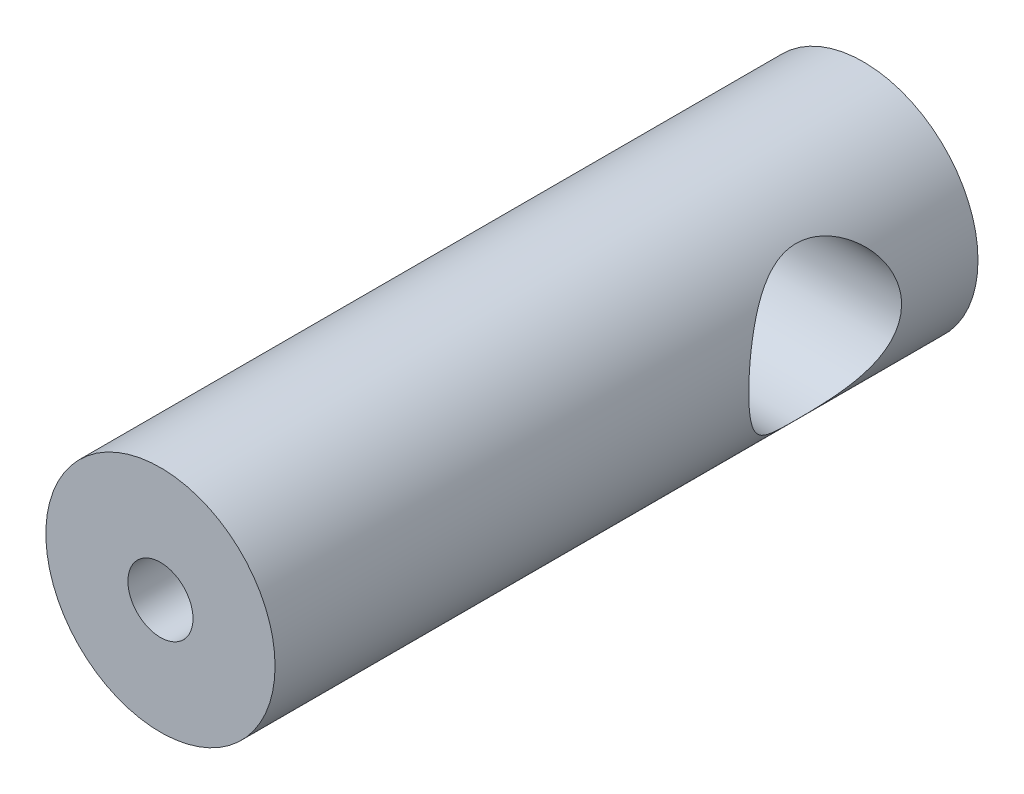
ISO-10303-21;
HEADER;
FILE_DESCRIPTION(('STEP AP214'),'2;1');
FILE_NAME('part.step','',(''),(''),'','','');
FILE_SCHEMA(('AUTOMOTIVE_DESIGN { 1 0 10303 214 1 1 1 1 }'));
ENDSEC;
DATA;
#1=APPLICATION_CONTEXT('core data for automotive mechanical design processes');
#2=APPLICATION_PROTOCOL_DEFINITION('international standard','automotive_design',2000,#1);
#3=PRODUCT_CONTEXT('',#1,'mechanical');
#4=PRODUCT('Part','Part','',(#3));
#5=PRODUCT_RELATED_PRODUCT_CATEGORY('part','',(#4));
#6=PRODUCT_DEFINITION_FORMATION('','',#4);
#7=PRODUCT_DEFINITION_CONTEXT('part definition',#1,'design');
#8=PRODUCT_DEFINITION('design','',#6,#7);
#9=PRODUCT_DEFINITION_SHAPE('','',#8);
#10=(LENGTH_UNIT() NAMED_UNIT(*) SI_UNIT(.MILLI.,.METRE.));
#11=(NAMED_UNIT(*) PLANE_ANGLE_UNIT() SI_UNIT($,.RADIAN.));
#12=(NAMED_UNIT(*) SI_UNIT($,.STERADIAN.) SOLID_ANGLE_UNIT());
#13=UNCERTAINTY_MEASURE_WITH_UNIT(LENGTH_MEASURE(1.E-05),#10,'distance_accuracy_value','');
#14=(GEOMETRIC_REPRESENTATION_CONTEXT(3) GLOBAL_UNCERTAINTY_ASSIGNED_CONTEXT((#13)) GLOBAL_UNIT_ASSIGNED_CONTEXT((#10,
#11,#12)) REPRESENTATION_CONTEXT('',''));
#15=CARTESIAN_POINT('',(0.,0.,0.));
#16=DIRECTION('',(0.,0.,1.));
#17=DIRECTION('',(1.,0.,0.));
#18=AXIS2_PLACEMENT_3D('',#15,#16,#17);
#19=CARTESIAN_POINT('',(0.,0.,29.21));
#20=DIRECTION('',(0.,0.,-1.));
#21=DIRECTION('',(-1.,0.,0.));
#22=AXIS2_PLACEMENT_3D('',#19,#20,#21);
#23=CYLINDRICAL_SURFACE('',#22,4.7625);
#24=CARTESIAN_POINT('',(-4.7625,0.,3.175));
#25=CARTESIAN_POINT('',(-4.76249829558772,0.159513506146526,3.17500214612326));
#26=CARTESIAN_POINT('',(-4.75441585981929,0.319036822940597,3.18708798621756));
#27=CARTESIAN_POINT('',(-4.72288699141972,0.632990333269339,3.2346842124704));
#28=CARTESIAN_POINT('',(-4.6994332647002,0.787418072256469,3.27020571953271));
#29=CARTESIAN_POINT('',(-4.63947623936465,1.08618661185831,3.36249621667313));
#30=CARTESIAN_POINT('',(-4.60303407934685,1.23057094564588,3.41916571764626));
#31=CARTESIAN_POINT('',(-4.52002748417047,1.50719688917279,3.55133803130145));
#32=CARTESIAN_POINT('',(-4.47346157948094,1.63943673208792,3.62684357839962));
#33=CARTESIAN_POINT('',(-4.36923384005694,1.90068942785739,3.80151790553973));
#34=CARTESIAN_POINT('',(-4.31096574538352,2.0284762255929,3.90215098363579));
#35=CARTESIAN_POINT('',(-4.19071922389352,2.26651828028912,4.12072144753205));
#36=CARTESIAN_POINT('',(-4.12873555797057,2.37674794067855,4.23868362477028));
#37=CARTESIAN_POINT('',(-3.99618620055343,2.59432897361932,4.51017063514477));
#38=CARTESIAN_POINT('',(-3.92580920318787,2.69848308269039,4.66636997487355));
#39=CARTESIAN_POINT('',(-3.79546083955007,2.87893691841686,4.99802686160152));
#40=CARTESIAN_POINT('',(-3.73547157335729,2.95528481583058,5.17345041238712));
#41=CARTESIAN_POINT('',(-3.65087323287846,3.0587003056751,5.48752917837351));
#42=CARTESIAN_POINT('',(-3.62104984276855,3.09363184983488,5.62217641895692));
#43=CARTESIAN_POINT('',(-3.57597026836952,3.14564105737718,5.89715690125781));
#44=CARTESIAN_POINT('',(-3.56068897885195,3.16274949511548,6.03747990609092));
#45=CARTESIAN_POINT('',(-3.54705611398895,3.17803790572636,6.32059121144639));
#46=CARTESIAN_POINT('',(-3.54877374048434,3.17614050629003,6.46338722475806));
#47=CARTESIAN_POINT('',(-3.56901393593137,3.1533716036927,6.74629552040347));
#48=CARTESIAN_POINT('',(-3.58755074204361,3.13248402562585,6.88640542637181));
#49=CARTESIAN_POINT('',(-3.63739407712628,3.07443178311274,7.1540164439586));
#50=CARTESIAN_POINT('',(-3.66810112544892,3.03802591942409,7.28180112117996));
#51=CARTESIAN_POINT('',(-3.73871526235139,2.95068813219861,7.52955010979677));
#52=CARTESIAN_POINT('',(-3.77862537744388,2.89975142875274,7.64951183185715));
#53=CARTESIAN_POINT('',(-3.87293161809884,2.77294687249444,7.90420281498847));
#54=CARTESIAN_POINT('',(-3.92862304429405,2.69411533030023,8.03697259197917));
#55=CARTESIAN_POINT('',(-4.04322816135652,2.51886974692605,8.28894614005392));
#56=CARTESIAN_POINT('',(-4.10214576296336,2.42243402035991,8.40813288170832));
#57=CARTESIAN_POINT('',(-4.23137558230652,2.19045099950254,8.65591129113202));
#58=CARTESIAN_POINT('',(-4.30140657245416,2.05095377025593,8.78099280228032));
#59=CARTESIAN_POINT('',(-4.43258734804499,1.74943769853673,9.00619943508341));
#60=CARTESIAN_POINT('',(-4.493745420159,1.58744015020742,9.10634790583761));
#61=CARTESIAN_POINT('',(-4.59018328993748,1.2777118005163,9.26064587831312));
#62=CARTESIAN_POINT('',(-4.62818577100373,1.13340775885305,9.31996383930038));
#63=CARTESIAN_POINT('',(-4.69118503960837,0.835082219747423,9.41721656943046));
#64=CARTESIAN_POINT('',(-4.71619281752454,0.681069057915079,9.45516941057244));
#65=CARTESIAN_POINT('',(-4.75100462923954,0.366689406911029,9.50779334981527));
#66=CARTESIAN_POINT('',(-4.76074299407139,0.20629850144547,9.52236389423949));
#67=CARTESIAN_POINT('',(-4.76381945007165,-0.115000912030588,9.52697975309251));
#68=CARTESIAN_POINT('',(-4.75715868774695,-0.275909383071223,9.51702678202589));
#69=CARTESIAN_POINT('',(-4.72915598211033,-0.581748451061776,9.47479681179543));
#70=CARTESIAN_POINT('',(-4.70887816144478,-0.72700744342839,9.44413703981371));
#71=CARTESIAN_POINT('',(-4.65643038239684,-1.00983477297833,9.36371684845446));
#72=CARTESIAN_POINT('',(-4.62425852748368,-1.14740187964355,9.313953382901));
#73=CARTESIAN_POINT('',(-4.54812959640013,-1.42028029136544,9.19376447844169));
#74=CARTESIAN_POINT('',(-4.50357668840463,-1.55495019310495,9.12227005539697));
#75=CARTESIAN_POINT('',(-4.40692945783369,-1.81083430052963,8.96233715220837));
#76=CARTESIAN_POINT('',(-4.35483048266614,-1.93204012275933,8.87388820764801));
#77=CARTESIAN_POINT('',(-4.23790342811905,-2.17781894704303,8.66678500930826));
#78=CARTESIAN_POINT('',(-4.17236523918599,-2.29989360271145,8.54556606216409));
#79=CARTESIAN_POINT('',(-4.04131737275621,-2.52307674305787,8.28498560490976));
#80=CARTESIAN_POINT('',(-3.97580774594569,-2.62417073664107,8.14561166279185));
#81=CARTESIAN_POINT('',(-3.85666740360083,-2.79598082787364,7.86266141984501));
#82=CARTESIAN_POINT('',(-3.80250060257811,-2.86854322403869,7.72043789728911));
#83=CARTESIAN_POINT('',(-3.70584371667973,-2.99237739257787,7.42335216383611));
#84=CARTESIAN_POINT('',(-3.66333266217137,-3.04368748566418,7.2685133089184));
#85=CARTESIAN_POINT('',(-3.60256467927561,-3.11524401668582,6.97775387782636));
#86=CARTESIAN_POINT('',(-3.58132059145467,-3.13941774208684,6.84343975609328));
#87=CARTESIAN_POINT('',(-3.55408653184003,-3.17022488831674,6.57133991164026));
#88=CARTESIAN_POINT('',(-3.54807999179148,-3.17687736084457,6.43355812425448));
#89=CARTESIAN_POINT('',(-3.55225668535638,-3.17220478264998,6.15847916327206));
#90=CARTESIAN_POINT('',(-3.56244950530632,-3.16086908702961,6.02118232484977));
#91=CARTESIAN_POINT('',(-3.59744096141944,-3.12097725174618,5.75096708934584));
#92=CARTESIAN_POINT('',(-3.6222590824651,-3.09239813794198,5.61805478357153));
#93=CARTESIAN_POINT('',(-3.69136350740653,-3.00978981561158,5.32493377101032));
#94=CARTESIAN_POINT('',(-3.7390752101256,-2.9510082914772,5.16688867807124));
#95=CARTESIAN_POINT('',(-3.84527739400297,-2.81121528101009,4.86491347639415));
#96=CARTESIAN_POINT('',(-3.90378297026142,-2.7301725841297,4.7210035728833));
#97=CARTESIAN_POINT('',(-4.02617059026332,-2.54632873237353,4.44614450366364));
#98=CARTESIAN_POINT('',(-4.09013111420677,-2.44315837250285,4.31547893626395));
#99=CARTESIAN_POINT('',(-4.21685775015533,-2.21726660759133,4.07140861594258));
#100=CARTESIAN_POINT('',(-4.27962348959933,-2.09453921249741,3.95800917227569));
#101=CARTESIAN_POINT('',(-4.37333498138708,-1.88738506601081,3.79508141501688));
#102=CARTESIAN_POINT('',(-4.40641312548886,-1.8090134436431,3.73897238013268));
#103=CARTESIAN_POINT('',(-4.46961905722943,-1.64665981934885,3.63366220114295));
#104=CARTESIAN_POINT('',(-4.49974819878214,-1.56268042207704,3.58445788247664));
#105=CARTESIAN_POINT('',(-4.55616827072524,-1.38960715113393,3.49357643775622));
#106=CARTESIAN_POINT('',(-4.58246276002165,-1.30051812806183,3.45189232363784));
#107=CARTESIAN_POINT('',(-4.63042056995049,-1.11782960098096,3.37664327179394));
#108=CARTESIAN_POINT('',(-4.65208551661339,-1.02423169482463,3.34307548283161));
#109=CARTESIAN_POINT('',(-4.70058109652366,-0.780235392827377,3.26845860015882));
#110=CARTESIAN_POINT('',(-4.72362103868264,-0.627104096318097,3.23357234310822));
#111=CARTESIAN_POINT('',(-4.75457565287333,-0.315982580686495,3.18685063903055));
#112=CARTESIAN_POINT('',(-4.76250168819873,-0.15799610278521,3.17499787429216));
#113=CARTESIAN_POINT('',(-4.7625,0.,3.175));
#114=B_SPLINE_CURVE_WITH_KNOTS('',3,(#24,#25,#26,#27,#28,#29,#30,#31,#32,#33,#34,#35,#36,#37,
#38,#39,#40,#41,#42,#43,#44,#45,#46,#47,#48,#49,#50,#51,#52,#53,#54,#55,#56,#57,#58,#59,#60,#61,
#62,#63,#64,#65,#66,#67,#68,#69,#70,#71,#72,#73,#74,#75,#76,#77,#78,#79,#80,#81,#82,#83,#84,#85,
#86,#87,#88,#89,#90,#91,#92,#93,#94,#95,#96,#97,#98,#99,#100,#101,#102,#103,#104,#105,#106,#107,
#108,#109,#110,#111,#112,#113),.UNSPECIFIED.,.T.,.F.,(4,2,2,2,2,2,2,2,2,2,2,2,2,2,2,2,2,2,2,2,2,
2,2,2,2,2,2,2,2,2,2,2,2,2,2,2,2,2,2,2,2,2,2,2,4),(0.,0.477921997077322,0.956070945278542,
1.43199826818949,1.90799472139476,2.42438283538384,2.94151703421856,3.54023109732372,
4.13790297394634,4.56300988710696,4.98738156455222,5.41348154879913,5.83994255655572,
6.24758818745149,6.6553680680092,7.14609274784495,7.63742604761198,8.23466340273952,
8.83133933988771,9.31106989228961,9.79039404549574,10.2717740223998,10.7531203456965,
11.2006552211841,11.6482614879236,12.1229810060221,12.5979944723587,13.1481222963466,
13.6986288317687,14.2025677230621,14.7055939480251,15.1181442623597,15.5302458053914,
15.9425913096208,16.3554874162604,16.8784049132826,17.4020593249786,17.9352455177248,
18.4685953331297,18.7739424593009,19.0791487337135,19.3840699212457,19.6888838348845,
20.1626158186784,20.635991489477),.UNSPECIFIED.);
#115=CARTESIAN_POINT('',(-4.7625,0.,3.175));
#116=VERTEX_POINT('',#115);
#117=EDGE_CURVE('E11',#116,#116,#114,.T.);
#118=ORIENTED_EDGE('',*,*,#117,.T.);
#119=EDGE_LOOP('',(#118));
#120=FACE_BOUND('',#119,.T.);
#121=CARTESIAN_POINT('',(4.7625,0.,3.175));
#122=CARTESIAN_POINT('',(4.76249829558771,-0.159513506146526,3.17500214612326));
#123=CARTESIAN_POINT('',(4.75441585981929,-0.319036822940598,3.18708798621756));
#124=CARTESIAN_POINT('',(4.72288699141973,-0.632990333269339,3.2346842124704));
#125=CARTESIAN_POINT('',(4.6994332647002,-0.787418072256469,3.27020571953271));
#126=CARTESIAN_POINT('',(4.63947623936465,-1.08618661185831,3.36249621667313));
#127=CARTESIAN_POINT('',(4.60303407934685,-1.23057094564588,3.41916571764626));
#128=CARTESIAN_POINT('',(4.52002748417047,-1.50719688917279,3.55133803130145));
#129=CARTESIAN_POINT('',(4.47346157948094,-1.63943673208792,3.62684357839962));
#130=CARTESIAN_POINT('',(4.36923384005694,-1.9006894278574,3.80151790553973));
#131=CARTESIAN_POINT('',(4.31096574538352,-2.0284762255929,3.90215098363579));
#132=CARTESIAN_POINT('',(4.19071922389352,-2.26651828028912,4.12072144753205));
#133=CARTESIAN_POINT('',(4.12873555797056,-2.37674794067855,4.23868362477028));
#134=CARTESIAN_POINT('',(3.99618620055343,-2.59432897361933,4.51017063514477));
#135=CARTESIAN_POINT('',(3.92580920318787,-2.69848308269039,4.66636997487356));
#136=CARTESIAN_POINT('',(3.79546083955007,-2.87893691841686,4.99802686160152));
#137=CARTESIAN_POINT('',(3.73547157335728,-2.95528481583058,5.17345041238712));
#138=CARTESIAN_POINT('',(3.65087323287846,-3.0587003056751,5.48752917837351));
#139=CARTESIAN_POINT('',(3.62104984276855,-3.09363184983488,5.62217641895692));
#140=CARTESIAN_POINT('',(3.57597026836952,-3.14564105737718,5.89715690125782));
#141=CARTESIAN_POINT('',(3.56068897885195,-3.16274949511548,6.03747990609092));
#142=CARTESIAN_POINT('',(3.54705611398895,-3.17803790572636,6.32059121144639));
#143=CARTESIAN_POINT('',(3.54877374048434,-3.17614050629003,6.46338722475806));
#144=CARTESIAN_POINT('',(3.56901393593137,-3.1533716036927,6.74629552040347));
#145=CARTESIAN_POINT('',(3.58755074204361,-3.13248402562585,6.88640542637181));
#146=CARTESIAN_POINT('',(3.63739407712628,-3.07443178311274,7.1540164439586));
#147=CARTESIAN_POINT('',(3.66810112544892,-3.03802591942409,7.28180112117996));
#148=CARTESIAN_POINT('',(3.73871526235139,-2.95068813219861,7.52955010979677));
#149=CARTESIAN_POINT('',(3.77862537744388,-2.89975142875274,7.64951183185715));
#150=CARTESIAN_POINT('',(3.87293161809884,-2.77294687249444,7.90420281498847));
#151=CARTESIAN_POINT('',(3.92862304429405,-2.69411533030023,8.03697259197917));
#152=CARTESIAN_POINT('',(4.04322816135652,-2.51886974692605,8.28894614005392));
#153=CARTESIAN_POINT('',(4.10214576296336,-2.42243402035992,8.40813288170832));
#154=CARTESIAN_POINT('',(4.23137558230652,-2.19045099950254,8.65591129113202));
#155=CARTESIAN_POINT('',(4.30140657245416,-2.05095377025594,8.78099280228032));
#156=CARTESIAN_POINT('',(4.43258734804498,-1.74943769853673,9.00619943508341));
#157=CARTESIAN_POINT('',(4.493745420159,-1.58744015020742,9.10634790583761));
#158=CARTESIAN_POINT('',(4.59018328993748,-1.2777118005163,9.26064587831312));
#159=CARTESIAN_POINT('',(4.62818577100373,-1.13340775885305,9.31996383930038));
#160=CARTESIAN_POINT('',(4.69118503960838,-0.835082219747425,9.41721656943046));
#161=CARTESIAN_POINT('',(4.71619281752454,-0.681069057915081,9.45516941057244));
#162=CARTESIAN_POINT('',(4.75100462923954,-0.366689406911031,9.50779334981527));
#163=CARTESIAN_POINT('',(4.76074299407139,-0.206298501445472,9.52236389423949));
#164=CARTESIAN_POINT('',(4.76381945007165,0.115000912030586,9.52697975309251));
#165=CARTESIAN_POINT('',(4.75715868774695,0.275909383071221,9.51702678202589));
#166=CARTESIAN_POINT('',(4.72915598211033,0.581748451061775,9.47479681179543));
#167=CARTESIAN_POINT('',(4.70887816144478,0.727007443428389,9.44413703981371));
#168=CARTESIAN_POINT('',(4.65643038239684,1.00983477297833,9.36371684845446));
#169=CARTESIAN_POINT('',(4.62425852748368,1.14740187964354,9.313953382901));
#170=CARTESIAN_POINT('',(4.54812959640013,1.42028029136544,9.19376447844169));
#171=CARTESIAN_POINT('',(4.50357668840463,1.55495019310495,9.12227005539697));
#172=CARTESIAN_POINT('',(4.40692945783369,1.81083430052963,8.96233715220837));
#173=CARTESIAN_POINT('',(4.35483048266614,1.93204012275933,8.87388820764801));
#174=CARTESIAN_POINT('',(4.23790342811905,2.17781894704303,8.66678500930826));
#175=CARTESIAN_POINT('',(4.17236523918599,2.29989360271145,8.54556606216409));
#176=CARTESIAN_POINT('',(4.04131737275621,2.52307674305787,8.28498560490976));
#177=CARTESIAN_POINT('',(3.97580774594569,2.62417073664107,8.14561166279185));
#178=CARTESIAN_POINT('',(3.85666740360083,2.79598082787364,7.86266141984501));
#179=CARTESIAN_POINT('',(3.8025006025781,2.86854322403869,7.72043789728911));
#180=CARTESIAN_POINT('',(3.70584371667973,2.99237739257787,7.42335216383611));
#181=CARTESIAN_POINT('',(3.66333266217137,3.04368748566418,7.2685133089184));
#182=CARTESIAN_POINT('',(3.60256467927561,3.11524401668582,6.97775387782636));
#183=CARTESIAN_POINT('',(3.58132059145467,3.13941774208684,6.84343975609328));
#184=CARTESIAN_POINT('',(3.55408653184003,3.17022488831674,6.57133991164026));
#185=CARTESIAN_POINT('',(3.54807999179148,3.17687736084457,6.43355812425448));
#186=CARTESIAN_POINT('',(3.55225668535638,3.17220478264998,6.15847916327206));
#187=CARTESIAN_POINT('',(3.56244950530632,3.16086908702961,6.02118232484977));
#188=CARTESIAN_POINT('',(3.59744096141944,3.12097725174618,5.75096708934584));
#189=CARTESIAN_POINT('',(3.6222590824651,3.09239813794198,5.61805478357153));
#190=CARTESIAN_POINT('',(3.69136350740653,3.00978981561158,5.32493377101032));
#191=CARTESIAN_POINT('',(3.7390752101256,2.9510082914772,5.16688867807125));
#192=CARTESIAN_POINT('',(3.84527739400296,2.8112152810101,4.86491347639415));
#193=CARTESIAN_POINT('',(3.90378297026142,2.7301725841297,4.72100357288331));
#194=CARTESIAN_POINT('',(4.02617059026332,2.54632873237354,4.44614450366364));
#195=CARTESIAN_POINT('',(4.09013111420677,2.44315837250285,4.31547893626395));
#196=CARTESIAN_POINT('',(4.21685775015533,2.21726660759133,4.07140861594258));
#197=CARTESIAN_POINT('',(4.27962348959933,2.09453921249741,3.9580091722757));
#198=CARTESIAN_POINT('',(4.37333498138708,1.88738506601081,3.79508141501688));
#199=CARTESIAN_POINT('',(4.40641312548886,1.8090134436431,3.73897238013268));
#200=CARTESIAN_POINT('',(4.46961905722943,1.64665981934885,3.63366220114295));
#201=CARTESIAN_POINT('',(4.49974819878214,1.56268042207704,3.58445788247664));
#202=CARTESIAN_POINT('',(4.55616827072524,1.38960715113393,3.49357643775622));
#203=CARTESIAN_POINT('',(4.58246276002165,1.30051812806183,3.45189232363784));
#204=CARTESIAN_POINT('',(4.63042056995049,1.11782960098096,3.37664327179394));
#205=CARTESIAN_POINT('',(4.65208551661339,1.02423169482463,3.34307548283161));
#206=CARTESIAN_POINT('',(4.70058109652366,0.780235392827378,3.26845860015882));
#207=CARTESIAN_POINT('',(4.72362103868264,0.627104096318098,3.23357234310822));
#208=CARTESIAN_POINT('',(4.75457565287333,0.315982580686496,3.18685063903055));
#209=CARTESIAN_POINT('',(4.76250168819872,0.15799610278521,3.17499787429216));
#210=CARTESIAN_POINT('',(4.7625,0.,3.175));
#211=B_SPLINE_CURVE_WITH_KNOTS('',3,(#121,#122,#123,#124,#125,#126,#127,#128,#129,#130,#131,
#132,#133,#134,#135,#136,#137,#138,#139,#140,#141,#142,#143,#144,#145,#146,#147,#148,#149,#150,
#151,#152,#153,#154,#155,#156,#157,#158,#159,#160,#161,#162,#163,#164,#165,#166,#167,#168,#169,
#170,#171,#172,#173,#174,#175,#176,#177,#178,#179,#180,#181,#182,#183,#184,#185,#186,#187,#188,
#189,#190,#191,#192,#193,#194,#195,#196,#197,#198,#199,#200,#201,#202,#203,#204,#205,#206,#207,
#208,#209,#210),.UNSPECIFIED.,.T.,.F.,(4,2,2,2,2,2,2,2,2,2,2,2,2,2,2,2,2,2,2,2,2,2,2,2,2,2,2,2,
2,2,2,2,2,2,2,2,2,2,2,2,2,2,2,2,4),(0.,0.477921997077322,0.956070945278543,1.43199826818949,
1.90799472139476,2.42438283538384,2.94151703421856,3.54023109732372,4.13790297394634,
4.56300988710696,4.98738156455222,5.41348154879913,5.83994255655572,6.24758818745149,
6.6553680680092,7.14609274784495,7.63742604761198,8.23466340273952,8.83133933988771,
9.31106989228962,9.79039404549574,10.2717740223998,10.7531203456965,11.2006552211841,
11.6482614879236,12.1229810060221,12.5979944723587,13.1481222963466,13.6986288317687,
14.2025677230621,14.7055939480251,15.1181442623597,15.5302458053914,15.9425913096208,
16.3554874162604,16.8784049132826,17.4020593249786,17.9352455177248,18.4685953331297,
18.7739424593009,19.0791487337135,19.3840699212457,19.6888838348845,20.1626158186784,
20.635991489477),.UNSPECIFIED.);
#212=CARTESIAN_POINT('',(4.7625,0.,3.175));
#213=VERTEX_POINT('',#212);
#214=EDGE_CURVE('E61',#213,#213,#211,.T.);
#215=ORIENTED_EDGE('',*,*,#214,.T.);
#216=EDGE_LOOP('',(#215));
#217=FACE_BOUND('',#216,.T.);
#218=CARTESIAN_POINT('',(0.,0.,29.21));
#219=DIRECTION('',(0.,0.,1.));
#220=DIRECTION('',(1.,0.,0.));
#221=AXIS2_PLACEMENT_3D('',#218,#219,#220);
#222=CIRCLE('',#221,4.7625);
#223=CARTESIAN_POINT('',(4.7625,0.,29.21));
#224=VERTEX_POINT('',#223);
#225=EDGE_CURVE('E81',#224,#224,#222,.T.);
#226=ORIENTED_EDGE('',*,*,#225,.F.);
#227=EDGE_LOOP('',(#226));
#228=FACE_BOUND('',#227,.T.);
#229=CARTESIAN_POINT('',(0.,0.,0.));
#230=DIRECTION('',(0.,0.,1.));
#231=DIRECTION('',(1.,0.,0.));
#232=AXIS2_PLACEMENT_3D('',#229,#230,#231);
#233=CIRCLE('',#232,4.7625);
#234=CARTESIAN_POINT('',(4.7625,0.,0.));
#235=VERTEX_POINT('',#234);
#236=EDGE_CURVE('E75',#235,#235,#233,.T.);
#237=ORIENTED_EDGE('',*,*,#236,.T.);
#238=EDGE_LOOP('',(#237));
#239=FACE_BOUND('',#238,.T.);
#240=ADVANCED_FACE('F49',(#120,#217,#228,#239),#23,.T.);
#241=CARTESIAN_POINT('',(0.,0.,29.21));
#242=DIRECTION('',(0.,0.,1.));
#243=DIRECTION('',(1.,0.,0.));
#244=AXIS2_PLACEMENT_3D('',#241,#242,#243);
#245=PLANE('',#244);
#246=CARTESIAN_POINT('',(0.,0.,29.21));
#247=DIRECTION('',(0.,0.,1.));
#248=DIRECTION('',(1.,0.,0.));
#249=AXIS2_PLACEMENT_3D('',#246,#247,#248);
#250=CIRCLE('',#249,1.35254999999999);
#251=CARTESIAN_POINT('',(1.35254999999999,0.,29.21));
#252=VERTEX_POINT('',#251);
#253=EDGE_CURVE('E76',#252,#252,#250,.T.);
#254=ORIENTED_EDGE('',*,*,#253,.F.);
#255=EDGE_LOOP('',(#254));
#256=FACE_BOUND('',#255,.T.);
#257=ORIENTED_EDGE('',*,*,#225,.T.);
#258=EDGE_LOOP('',(#257));
#259=FACE_BOUND('',#258,.T.);
#260=ADVANCED_FACE('F99',(#256,#259),#245,.T.);
#261=CARTESIAN_POINT('',(0.,0.,0.));
#262=DIRECTION('',(0.,0.,1.));
#263=DIRECTION('',(1.,0.,0.));
#264=AXIS2_PLACEMENT_3D('',#261,#262,#263);
#265=PLANE('',#264);
#266=ORIENTED_EDGE('',*,*,#236,.F.);
#267=EDGE_LOOP('',(#266));
#268=FACE_BOUND('',#267,.T.);
#269=ADVANCED_FACE('F96',(#268),#265,.F.);
#270=CARTESIAN_POINT('',(-4.7625,0.,6.35));
#271=DIRECTION('',(1.,0.,0.));
#272=DIRECTION('',(0.,0.,-1.));
#273=AXIS2_PLACEMENT_3D('',#270,#271,#272);
#274=CYLINDRICAL_SURFACE('',#273,3.175);
#275=ORIENTED_EDGE('',*,*,#214,.F.);
#276=EDGE_LOOP('',(#275));
#277=FACE_BOUND('',#276,.T.);
#278=ORIENTED_EDGE('',*,*,#117,.F.);
#279=EDGE_LOOP('',(#278));
#280=FACE_BOUND('',#279,.T.);
#281=ADVANCED_FACE('F68',(#277,#280),#274,.F.);
#282=CARTESIAN_POINT('',(0.,0.,16.51));
#283=DIRECTION('',(0.,0.,1.));
#284=DIRECTION('',(1.,0.,0.));
#285=AXIS2_PLACEMENT_3D('',#282,#283,#284);
#286=CONICAL_SURFACE('',#285,1.35255,1.02974425867665);
#287=CARTESIAN_POINT('',(0.,0.,15.6973059697343));
#288=VERTEX_POINT('',#287);
#289=VERTEX_LOOP('',#288);
#290=FACE_BOUND('',#289,.T.);
#291=CARTESIAN_POINT('',(0.,0.,16.51));
#292=DIRECTION('',(0.,0.,1.));
#293=DIRECTION('',(1.,0.,0.));
#294=AXIS2_PLACEMENT_3D('',#291,#292,#293);
#295=CIRCLE('',#294,1.35255);
#296=CARTESIAN_POINT('',(1.35255,0.,16.51));
#297=VERTEX_POINT('',#296);
#298=EDGE_CURVE('E72',#297,#297,#295,.T.);
#299=ORIENTED_EDGE('',*,*,#298,.T.);
#300=EDGE_LOOP('',(#299));
#301=FACE_BOUND('',#300,.T.);
#302=ADVANCED_FACE('F64',(#290,#301),#286,.F.);
#303=CARTESIAN_POINT('',(0.,0.,29.21));
#304=DIRECTION('',(0.,0.,1.));
#305=DIRECTION('',(1.,0.,0.));
#306=AXIS2_PLACEMENT_3D('',#303,#304,#305);
#307=CYLINDRICAL_SURFACE('',#306,1.35254999999999);
#308=ORIENTED_EDGE('',*,*,#298,.F.);
#309=EDGE_LOOP('',(#308));
#310=FACE_BOUND('',#309,.T.);
#311=ORIENTED_EDGE('',*,*,#253,.T.);
#312=EDGE_LOOP('',(#311));
#313=FACE_BOUND('',#312,.T.);
#314=ADVANCED_FACE('F67',(#310,#313),#307,.F.);
#315=CLOSED_SHELL('',(#240,#260,#269,#281,#302,#314));
#316=MANIFOLD_SOLID_BREP('B2',#315);
#317=ADVANCED_BREP_SHAPE_REPRESENTATION('',(#18,#316),#14);
#318=SHAPE_DEFINITION_REPRESENTATION(#9,#317);
ENDSEC;
END-ISO-10303-21;
